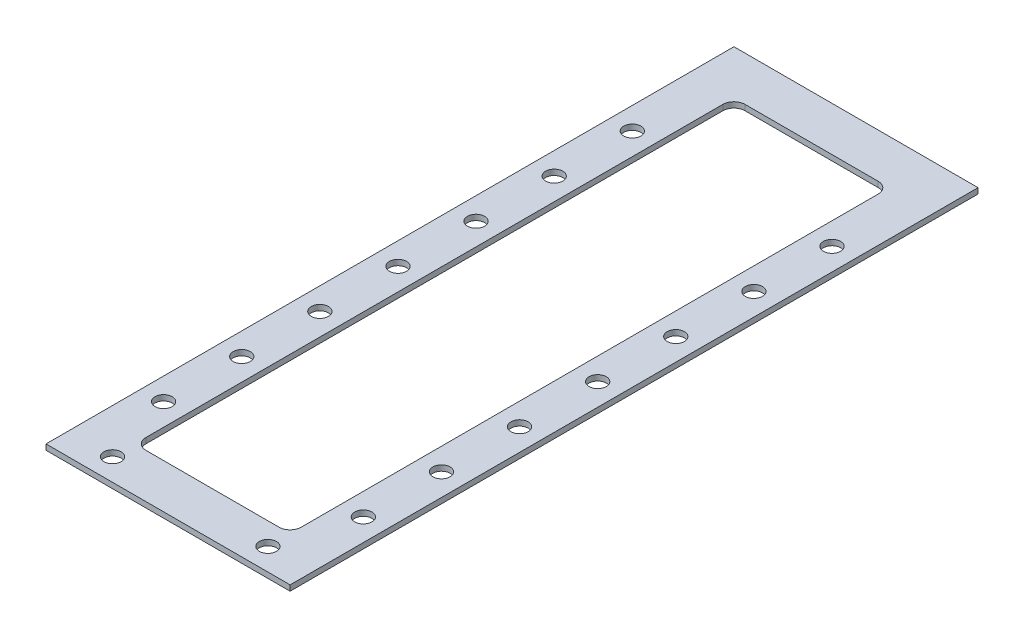
ISO-10303-21;
HEADER;
FILE_DESCRIPTION(('STEP AP214'),'2;1');
FILE_NAME('part.step','',(''),(''),'','','');
FILE_SCHEMA(('AUTOMOTIVE_DESIGN { 1 0 10303 214 1 1 1 1 }'));
ENDSEC;
DATA;
#1=APPLICATION_CONTEXT('core data for automotive mechanical design processes');
#2=APPLICATION_PROTOCOL_DEFINITION('international standard','automotive_design',2000,#1);
#3=PRODUCT_CONTEXT('',#1,'mechanical');
#4=PRODUCT('Part','Part','',(#3));
#5=PRODUCT_RELATED_PRODUCT_CATEGORY('part','',(#4));
#6=PRODUCT_DEFINITION_FORMATION('','',#4);
#7=PRODUCT_DEFINITION_CONTEXT('part definition',#1,'design');
#8=PRODUCT_DEFINITION('design','',#6,#7);
#9=PRODUCT_DEFINITION_SHAPE('','',#8);
#10=(LENGTH_UNIT() NAMED_UNIT(*) SI_UNIT(.MILLI.,.METRE.));
#11=(NAMED_UNIT(*) PLANE_ANGLE_UNIT() SI_UNIT($,.RADIAN.));
#12=(NAMED_UNIT(*) SI_UNIT($,.STERADIAN.) SOLID_ANGLE_UNIT());
#13=UNCERTAINTY_MEASURE_WITH_UNIT(LENGTH_MEASURE(1.E-05),#10,'distance_accuracy_value','');
#14=(GEOMETRIC_REPRESENTATION_CONTEXT(3) GLOBAL_UNCERTAINTY_ASSIGNED_CONTEXT((#13)) GLOBAL_UNIT_ASSIGNED_CONTEXT((#10,
#11,#12)) REPRESENTATION_CONTEXT('',''));
#15=CARTESIAN_POINT('',(0.,0.,0.));
#16=DIRECTION('',(0.,0.,1.));
#17=DIRECTION('',(1.,0.,0.));
#18=AXIS2_PLACEMENT_3D('',#15,#16,#17);
#19=CARTESIAN_POINT('',(0.0253999999999636,1.5875,-196.8246));
#20=DIRECTION('',(0.,-1.,0.));
#21=DIRECTION('',(0.,0.,-1.));
#22=AXIS2_PLACEMENT_3D('',#19,#20,#21);
#23=PLANE('',#22);
#24=CARTESIAN_POINT('',(57.15,1.5875,-6.35));
#25=DIRECTION('',(0.,-1.,0.));
#26=DIRECTION('',(0.,0.,-1.));
#27=AXIS2_PLACEMENT_3D('',#24,#25,#26);
#28=CIRCLE('',#27,2.45745);
#29=CARTESIAN_POINT('',(57.15,1.5875,-8.80745));
#30=VERTEX_POINT('',#29);
#31=EDGE_CURVE('E434',#30,#30,#28,.T.);
#32=ORIENTED_EDGE('',*,*,#31,.T.);
#33=EDGE_LOOP('',(#32));
#34=FACE_BOUND('',#33,.T.);
#35=CARTESIAN_POINT('',(12.7,1.5875,-6.35000000000001));
#36=DIRECTION('',(0.,-1.,0.));
#37=DIRECTION('',(0.,0.,-1.));
#38=AXIS2_PLACEMENT_3D('',#35,#36,#37);
#39=CIRCLE('',#38,2.45745);
#40=CARTESIAN_POINT('',(12.7,1.5875,-8.80745));
#41=VERTEX_POINT('',#40);
#42=EDGE_CURVE('E448',#41,#41,#39,.T.);
#43=ORIENTED_EDGE('',*,*,#42,.T.);
#44=EDGE_LOOP('',(#43));
#45=FACE_BOUND('',#44,.T.);
#46=CARTESIAN_POINT('',(63.5,1.5875,-27.305));
#47=DIRECTION('',(0.,-1.,0.));
#48=DIRECTION('',(0.,0.,-1.));
#49=AXIS2_PLACEMENT_3D('',#46,#47,#48);
#50=CIRCLE('',#49,2.45745);
#51=CARTESIAN_POINT('',(63.5,1.5875,-29.76245));
#52=VERTEX_POINT('',#51);
#53=EDGE_CURVE('E456',#52,#52,#50,.T.);
#54=ORIENTED_EDGE('',*,*,#53,.T.);
#55=EDGE_LOOP('',(#54));
#56=FACE_BOUND('',#55,.T.);
#57=CARTESIAN_POINT('',(6.34999999999999,1.5875,-27.305));
#58=DIRECTION('',(0.,-1.,0.));
#59=DIRECTION('',(0.,0.,-1.));
#60=AXIS2_PLACEMENT_3D('',#57,#58,#59);
#61=CIRCLE('',#60,2.45745);
#62=CARTESIAN_POINT('',(6.34999999999999,1.5875,-29.76245));
#63=VERTEX_POINT('',#62);
#64=EDGE_CURVE('E464',#63,#63,#61,.T.);
#65=ORIENTED_EDGE('',*,*,#64,.T.);
#66=EDGE_LOOP('',(#65));
#67=FACE_BOUND('',#66,.T.);
#68=CARTESIAN_POINT('',(63.5000000000004,1.5875,-139.065));
#69=DIRECTION('',(0.,-1.,0.));
#70=DIRECTION('',(0.,0.,-1.));
#71=AXIS2_PLACEMENT_3D('',#68,#69,#70);
#72=CIRCLE('',#71,2.45745);
#73=CARTESIAN_POINT('',(63.5000000000004,1.5875,-141.52245));
#74=VERTEX_POINT('',#73);
#75=EDGE_CURVE('E472',#74,#74,#72,.T.);
#76=ORIENTED_EDGE('',*,*,#75,.T.);
#77=EDGE_LOOP('',(#76));
#78=FACE_BOUND('',#77,.T.);
#79=CARTESIAN_POINT('',(63.5000000000003,1.5875,-116.713));
#80=DIRECTION('',(0.,-1.,0.));
#81=DIRECTION('',(0.,0.,-1.));
#82=AXIS2_PLACEMENT_3D('',#79,#80,#81);
#83=CIRCLE('',#82,2.45745);
#84=CARTESIAN_POINT('',(63.5000000000003,1.5875,-119.17045));
#85=VERTEX_POINT('',#84);
#86=EDGE_CURVE('E480',#85,#85,#83,.T.);
#87=ORIENTED_EDGE('',*,*,#86,.T.);
#88=EDGE_LOOP('',(#87));
#89=FACE_BOUND('',#88,.T.);
#90=CARTESIAN_POINT('',(63.5000000000002,1.5875,-94.361));
#91=DIRECTION('',(0.,-1.,0.));
#92=DIRECTION('',(0.,0.,-1.));
#93=AXIS2_PLACEMENT_3D('',#90,#91,#92);
#94=CIRCLE('',#93,2.45745);
#95=CARTESIAN_POINT('',(63.5000000000002,1.5875,-96.81845));
#96=VERTEX_POINT('',#95);
#97=EDGE_CURVE('E488',#96,#96,#94,.T.);
#98=ORIENTED_EDGE('',*,*,#97,.T.);
#99=EDGE_LOOP('',(#98));
#100=FACE_BOUND('',#99,.T.);
#101=CARTESIAN_POINT('',(63.5000000000002,1.5875,-72.009));
#102=DIRECTION('',(0.,-1.,0.));
#103=DIRECTION('',(0.,0.,-1.));
#104=AXIS2_PLACEMENT_3D('',#101,#102,#103);
#105=CIRCLE('',#104,2.45745);
#106=CARTESIAN_POINT('',(63.5000000000002,1.5875,-74.46645));
#107=VERTEX_POINT('',#106);
#108=EDGE_CURVE('E496',#107,#107,#105,.T.);
#109=ORIENTED_EDGE('',*,*,#108,.T.);
#110=EDGE_LOOP('',(#109));
#111=FACE_BOUND('',#110,.T.);
#112=CARTESIAN_POINT('',(6.35000000000007,1.5875,-49.657));
#113=DIRECTION('',(0.,-1.,0.));
#114=DIRECTION('',(0.,0.,-1.));
#115=AXIS2_PLACEMENT_3D('',#112,#113,#114);
#116=CIRCLE('',#115,2.45745);
#117=CARTESIAN_POINT('',(6.35000000000007,1.5875,-52.11445));
#118=VERTEX_POINT('',#117);
#119=EDGE_CURVE('E504',#118,#118,#116,.T.);
#120=ORIENTED_EDGE('',*,*,#119,.T.);
#121=EDGE_LOOP('',(#120));
#122=FACE_BOUND('',#121,.T.);
#123=CARTESIAN_POINT('',(6.35000000000015,1.5875,-72.009));
#124=DIRECTION('',(0.,-1.,0.));
#125=DIRECTION('',(0.,0.,-1.));
#126=AXIS2_PLACEMENT_3D('',#123,#124,#125);
#127=CIRCLE('',#126,2.45745);
#128=CARTESIAN_POINT('',(6.35000000000015,1.5875,-74.46645));
#129=VERTEX_POINT('',#128);
#130=EDGE_CURVE('E512',#129,#129,#127,.T.);
#131=ORIENTED_EDGE('',*,*,#130,.T.);
#132=EDGE_LOOP('',(#131));
#133=FACE_BOUND('',#132,.T.);
#134=CARTESIAN_POINT('',(6.35000000000022,1.5875,-94.361));
#135=DIRECTION('',(0.,-1.,0.));
#136=DIRECTION('',(0.,0.,-1.));
#137=AXIS2_PLACEMENT_3D('',#134,#135,#136);
#138=CIRCLE('',#137,2.45745);
#139=CARTESIAN_POINT('',(6.35000000000022,1.5875,-96.81845));
#140=VERTEX_POINT('',#139);
#141=EDGE_CURVE('E520',#140,#140,#138,.T.);
#142=ORIENTED_EDGE('',*,*,#141,.T.);
#143=EDGE_LOOP('',(#142));
#144=FACE_BOUND('',#143,.T.);
#145=CARTESIAN_POINT('',(6.3500000000003,1.5875,-116.713));
#146=DIRECTION('',(0.,-1.,0.));
#147=DIRECTION('',(0.,0.,-1.));
#148=AXIS2_PLACEMENT_3D('',#145,#146,#147);
#149=CIRCLE('',#148,2.45745);
#150=CARTESIAN_POINT('',(6.3500000000003,1.5875,-119.17045));
#151=VERTEX_POINT('',#150);
#152=EDGE_CURVE('E528',#151,#151,#149,.T.);
#153=ORIENTED_EDGE('',*,*,#152,.T.);
#154=EDGE_LOOP('',(#153));
#155=FACE_BOUND('',#154,.T.);
#156=CARTESIAN_POINT('',(6.35000000000038,1.5875,-139.065));
#157=DIRECTION('',(0.,-1.,0.));
#158=DIRECTION('',(0.,0.,-1.));
#159=AXIS2_PLACEMENT_3D('',#156,#157,#158);
#160=CIRCLE('',#159,2.45745);
#161=CARTESIAN_POINT('',(6.35000000000038,1.5875,-141.52245));
#162=VERTEX_POINT('',#161);
#163=EDGE_CURVE('E536',#162,#162,#160,.T.);
#164=ORIENTED_EDGE('',*,*,#163,.T.);
#165=EDGE_LOOP('',(#164));
#166=FACE_BOUND('',#165,.T.);
#167=CARTESIAN_POINT('',(63.5000000000001,1.5875,-49.657));
#168=DIRECTION('',(0.,-1.,0.));
#169=DIRECTION('',(0.,0.,-1.));
#170=AXIS2_PLACEMENT_3D('',#167,#168,#169);
#171=CIRCLE('',#170,2.45745);
#172=CARTESIAN_POINT('',(63.5000000000001,1.5875,-52.11445));
#173=VERTEX_POINT('',#172);
#174=EDGE_CURVE('E544',#173,#173,#171,.T.);
#175=ORIENTED_EDGE('',*,*,#174,.T.);
#176=EDGE_LOOP('',(#175));
#177=FACE_BOUND('',#176,.T.);
#178=CARTESIAN_POINT('',(63.5000000000005,1.5875,-161.417));
#179=DIRECTION('',(0.,-1.,0.));
#180=DIRECTION('',(0.,0.,-1.));
#181=AXIS2_PLACEMENT_3D('',#178,#179,#180);
#182=CIRCLE('',#181,2.45745);
#183=CARTESIAN_POINT('',(63.5000000000005,1.5875,-163.87445));
#184=VERTEX_POINT('',#183);
#185=EDGE_CURVE('E552',#184,#184,#182,.T.);
#186=ORIENTED_EDGE('',*,*,#185,.T.);
#187=EDGE_LOOP('',(#186));
#188=FACE_BOUND('',#187,.T.);
#189=CARTESIAN_POINT('',(6.35000000000045,1.5875,-161.417));
#190=DIRECTION('',(0.,-1.,0.));
#191=DIRECTION('',(0.,0.,-1.));
#192=AXIS2_PLACEMENT_3D('',#189,#190,#191);
#193=CIRCLE('',#192,2.45745);
#194=CARTESIAN_POINT('',(6.35000000000045,1.5875,-163.87445));
#195=VERTEX_POINT('',#194);
#196=EDGE_CURVE('E193',#195,#195,#193,.T.);
#197=ORIENTED_EDGE('',*,*,#196,.T.);
#198=EDGE_LOOP('',(#197));
#199=FACE_BOUND('',#198,.T.);
#200=DIRECTION('',(0.,0.,1.));
#201=VECTOR('',#200,1.);
#202=CARTESIAN_POINT('',(0.,1.5875,0.));
#203=LINE('',#202,#201);
#204=CARTESIAN_POINT('',(0.,1.5875,-196.8246));
#205=VERTEX_POINT('',#204);
#206=CARTESIAN_POINT('',(0.,1.5875,0.));
#207=VERTEX_POINT('',#206);
#208=EDGE_CURVE('E237',#205,#207,#203,.T.);
#209=ORIENTED_EDGE('',*,*,#208,.T.);
#210=DIRECTION('',(1.,0.,0.));
#211=VECTOR('',#210,1.);
#212=CARTESIAN_POINT('',(0.,1.5875,0.));
#213=LINE('',#212,#211);
#214=CARTESIAN_POINT('',(69.85,1.5875,0.));
#215=VERTEX_POINT('',#214);
#216=EDGE_CURVE('E241',#207,#215,#213,.T.);
#217=ORIENTED_EDGE('',*,*,#216,.T.);
#218=DIRECTION('',(0.,0.,-1.));
#219=VECTOR('',#218,1.);
#220=CARTESIAN_POINT('',(69.85,1.5875,0.));
#221=LINE('',#220,#219);
#222=CARTESIAN_POINT('',(69.85,1.5875,-196.8246));
#223=VERTEX_POINT('',#222);
#224=EDGE_CURVE('E245',#215,#223,#221,.T.);
#225=ORIENTED_EDGE('',*,*,#224,.T.);
#226=CARTESIAN_POINT('',(69.8246,1.5875,-196.8246));
#227=DIRECTION('',(0.,1.,0.));
#228=DIRECTION('',(0.,0.,1.));
#229=AXIS2_PLACEMENT_3D('',#226,#227,#228);
#230=CIRCLE('',#229,0.0254000000000087);
#231=CARTESIAN_POINT('',(69.8246,1.5875,-196.85));
#232=VERTEX_POINT('',#231);
#233=EDGE_CURVE('E248',#223,#232,#230,.T.);
#234=ORIENTED_EDGE('',*,*,#233,.T.);
#235=DIRECTION('',(-1.,0.,0.));
#236=VECTOR('',#235,1.);
#237=CARTESIAN_POINT('',(0.0253999999999636,1.5875,-196.85));
#238=LINE('',#237,#236);
#239=CARTESIAN_POINT('',(0.0253999999999636,1.5875,-196.85));
#240=VERTEX_POINT('',#239);
#241=EDGE_CURVE('E251',#232,#240,#238,.T.);
#242=ORIENTED_EDGE('',*,*,#241,.T.);
#243=CARTESIAN_POINT('',(0.0253999999999636,1.5875,-196.8246));
#244=DIRECTION('',(0.,1.,0.));
#245=DIRECTION('',(0.,0.,-1.));
#246=AXIS2_PLACEMENT_3D('',#243,#244,#245);
#247=CIRCLE('',#246,0.0254000000000044);
#248=EDGE_CURVE('E254',#240,#205,#247,.T.);
#249=ORIENTED_EDGE('',*,*,#248,.T.);
#250=EDGE_LOOP('',(#209,#217,#225,#234,#242,#249));
#251=FACE_BOUND('',#250,.T.);
#252=CARTESIAN_POINT('',(15.875,1.5875,-15.875));
#253=DIRECTION('',(0.,1.,0.));
#254=DIRECTION('',(0.,0.,1.));
#255=AXIS2_PLACEMENT_3D('',#252,#253,#254);
#256=CIRCLE('',#255,3.175);
#257=CARTESIAN_POINT('',(12.7,1.5875,-15.875));
#258=VERTEX_POINT('',#257);
#259=CARTESIAN_POINT('',(15.875,1.5875,-12.7));
#260=VERTEX_POINT('',#259);
#261=EDGE_CURVE('E145',#258,#260,#256,.T.);
#262=ORIENTED_EDGE('',*,*,#261,.F.);
#263=DIRECTION('',(0.,0.,1.));
#264=VECTOR('',#263,1.);
#265=CARTESIAN_POINT('',(12.7,1.5875,-15.875));
#266=LINE('',#265,#264);
#267=CARTESIAN_POINT('',(12.7,1.5875,-180.975));
#268=VERTEX_POINT('',#267);
#269=EDGE_CURVE('E188',#268,#258,#266,.T.);
#270=ORIENTED_EDGE('',*,*,#269,.F.);
#271=CARTESIAN_POINT('',(15.875,1.5875,-180.975));
#272=DIRECTION('',(0.,1.,0.));
#273=DIRECTION('',(0.,0.,-1.));
#274=AXIS2_PLACEMENT_3D('',#271,#272,#273);
#275=CIRCLE('',#274,3.17500000000001);
#276=CARTESIAN_POINT('',(15.875,1.5875,-184.15));
#277=VERTEX_POINT('',#276);
#278=EDGE_CURVE('E185',#277,#268,#275,.T.);
#279=ORIENTED_EDGE('',*,*,#278,.F.);
#280=DIRECTION('',(-1.,0.,0.));
#281=VECTOR('',#280,1.);
#282=CARTESIAN_POINT('',(15.875,1.5875,-184.15));
#283=LINE('',#282,#281);
#284=CARTESIAN_POINT('',(53.975,1.5875,-184.15));
#285=VERTEX_POINT('',#284);
#286=EDGE_CURVE('E182',#285,#277,#283,.T.);
#287=ORIENTED_EDGE('',*,*,#286,.F.);
#288=CARTESIAN_POINT('',(53.975,1.5875,-180.975));
#289=DIRECTION('',(0.,1.,0.));
#290=DIRECTION('',(0.,0.,-1.));
#291=AXIS2_PLACEMENT_3D('',#288,#289,#290);
#292=CIRCLE('',#291,3.17500000000001);
#293=CARTESIAN_POINT('',(57.15,1.5875,-180.975));
#294=VERTEX_POINT('',#293);
#295=EDGE_CURVE('E179',#294,#285,#292,.T.);
#296=ORIENTED_EDGE('',*,*,#295,.F.);
#297=DIRECTION('',(0.,0.,-1.));
#298=VECTOR('',#297,1.);
#299=CARTESIAN_POINT('',(57.15,1.5875,-15.875));
#300=LINE('',#299,#298);
#301=CARTESIAN_POINT('',(57.15,1.5875,-15.875));
#302=VERTEX_POINT('',#301);
#303=EDGE_CURVE('E173',#302,#294,#300,.T.);
#304=ORIENTED_EDGE('',*,*,#303,.F.);
#305=CARTESIAN_POINT('',(53.975,1.5875,-15.875));
#306=DIRECTION('',(0.,1.,0.));
#307=DIRECTION('',(0.,0.,-1.));
#308=AXIS2_PLACEMENT_3D('',#305,#306,#307);
#309=CIRCLE('',#308,3.175);
#310=CARTESIAN_POINT('',(53.975,1.5875,-12.7));
#311=VERTEX_POINT('',#310);
#312=EDGE_CURVE('E168',#311,#302,#309,.T.);
#313=ORIENTED_EDGE('',*,*,#312,.F.);
#314=DIRECTION('',(1.,0.,0.));
#315=VECTOR('',#314,1.);
#316=CARTESIAN_POINT('',(15.875,1.5875,-12.7));
#317=LINE('',#316,#315);
#318=EDGE_CURVE('E154',#260,#311,#317,.T.);
#319=ORIENTED_EDGE('',*,*,#318,.F.);
#320=EDGE_LOOP('',(#262,#270,#279,#287,#296,#304,#313,#319));
#321=FACE_BOUND('',#320,.T.);
#322=ADVANCED_FACE('F43',(#34,#45,#56,#67,#78,#89,#100,#111,#122,#133,#144,#155,#166,#177,#188,
#199,#251,#321),#23,.F.);
#323=CARTESIAN_POINT('',(0.0253999999999636,0.,-196.8246));
#324=DIRECTION('',(0.,-1.,0.));
#325=DIRECTION('',(0.,0.,-1.));
#326=AXIS2_PLACEMENT_3D('',#323,#324,#325);
#327=PLANE('',#326);
#328=CARTESIAN_POINT('',(57.15,0.,-6.35));
#329=DIRECTION('',(0.,-1.,0.));
#330=DIRECTION('',(0.,0.,-1.));
#331=AXIS2_PLACEMENT_3D('',#328,#329,#330);
#332=CIRCLE('',#331,2.45744999999999);
#333=CARTESIAN_POINT('',(57.15,0.,-8.80744999999999));
#334=VERTEX_POINT('',#333);
#335=EDGE_CURVE('E437',#334,#334,#332,.T.);
#336=ORIENTED_EDGE('',*,*,#335,.F.);
#337=EDGE_LOOP('',(#336));
#338=FACE_BOUND('',#337,.T.);
#339=CARTESIAN_POINT('',(12.7,0.,-6.35000000000001));
#340=DIRECTION('',(0.,-1.,0.));
#341=DIRECTION('',(0.,0.,-1.));
#342=AXIS2_PLACEMENT_3D('',#339,#340,#341);
#343=CIRCLE('',#342,2.45744999999999);
#344=CARTESIAN_POINT('',(12.7,0.,-8.80744999999999));
#345=VERTEX_POINT('',#344);
#346=EDGE_CURVE('E442',#345,#345,#343,.T.);
#347=ORIENTED_EDGE('',*,*,#346,.F.);
#348=EDGE_LOOP('',(#347));
#349=FACE_BOUND('',#348,.T.);
#350=CARTESIAN_POINT('',(63.5,0.,-27.305));
#351=DIRECTION('',(0.,-1.,0.));
#352=DIRECTION('',(0.,0.,-1.));
#353=AXIS2_PLACEMENT_3D('',#350,#351,#352);
#354=CIRCLE('',#353,2.45744999999999);
#355=CARTESIAN_POINT('',(63.5,0.,-29.76245));
#356=VERTEX_POINT('',#355);
#357=EDGE_CURVE('E452',#356,#356,#354,.T.);
#358=ORIENTED_EDGE('',*,*,#357,.F.);
#359=EDGE_LOOP('',(#358));
#360=FACE_BOUND('',#359,.T.);
#361=CARTESIAN_POINT('',(6.34999999999999,0.,-27.305));
#362=DIRECTION('',(0.,-1.,0.));
#363=DIRECTION('',(0.,0.,-1.));
#364=AXIS2_PLACEMENT_3D('',#361,#362,#363);
#365=CIRCLE('',#364,2.45744999999999);
#366=CARTESIAN_POINT('',(6.34999999999999,0.,-29.76245));
#367=VERTEX_POINT('',#366);
#368=EDGE_CURVE('E460',#367,#367,#365,.T.);
#369=ORIENTED_EDGE('',*,*,#368,.F.);
#370=EDGE_LOOP('',(#369));
#371=FACE_BOUND('',#370,.T.);
#372=CARTESIAN_POINT('',(63.5000000000004,0.,-139.065));
#373=DIRECTION('',(0.,-1.,0.));
#374=DIRECTION('',(0.,0.,-1.));
#375=AXIS2_PLACEMENT_3D('',#372,#373,#374);
#376=CIRCLE('',#375,2.45744999999999);
#377=CARTESIAN_POINT('',(63.5000000000004,0.,-141.52245));
#378=VERTEX_POINT('',#377);
#379=EDGE_CURVE('E468',#378,#378,#376,.T.);
#380=ORIENTED_EDGE('',*,*,#379,.F.);
#381=EDGE_LOOP('',(#380));
#382=FACE_BOUND('',#381,.T.);
#383=CARTESIAN_POINT('',(63.5000000000003,0.,-116.713));
#384=DIRECTION('',(0.,-1.,0.));
#385=DIRECTION('',(0.,0.,-1.));
#386=AXIS2_PLACEMENT_3D('',#383,#384,#385);
#387=CIRCLE('',#386,2.45744999999999);
#388=CARTESIAN_POINT('',(63.5000000000003,0.,-119.17045));
#389=VERTEX_POINT('',#388);
#390=EDGE_CURVE('E476',#389,#389,#387,.T.);
#391=ORIENTED_EDGE('',*,*,#390,.F.);
#392=EDGE_LOOP('',(#391));
#393=FACE_BOUND('',#392,.T.);
#394=CARTESIAN_POINT('',(63.5000000000002,0.,-94.361));
#395=DIRECTION('',(0.,-1.,0.));
#396=DIRECTION('',(0.,0.,-1.));
#397=AXIS2_PLACEMENT_3D('',#394,#395,#396);
#398=CIRCLE('',#397,2.45744999999999);
#399=CARTESIAN_POINT('',(63.5000000000002,0.,-96.81845));
#400=VERTEX_POINT('',#399);
#401=EDGE_CURVE('E484',#400,#400,#398,.T.);
#402=ORIENTED_EDGE('',*,*,#401,.F.);
#403=EDGE_LOOP('',(#402));
#404=FACE_BOUND('',#403,.T.);
#405=CARTESIAN_POINT('',(63.5000000000002,0.,-72.009));
#406=DIRECTION('',(0.,-1.,0.));
#407=DIRECTION('',(0.,0.,-1.));
#408=AXIS2_PLACEMENT_3D('',#405,#406,#407);
#409=CIRCLE('',#408,2.45744999999999);
#410=CARTESIAN_POINT('',(63.5000000000002,0.,-74.46645));
#411=VERTEX_POINT('',#410);
#412=EDGE_CURVE('E492',#411,#411,#409,.T.);
#413=ORIENTED_EDGE('',*,*,#412,.F.);
#414=EDGE_LOOP('',(#413));
#415=FACE_BOUND('',#414,.T.);
#416=CARTESIAN_POINT('',(6.35000000000007,0.,-49.657));
#417=DIRECTION('',(0.,-1.,0.));
#418=DIRECTION('',(0.,0.,-1.));
#419=AXIS2_PLACEMENT_3D('',#416,#417,#418);
#420=CIRCLE('',#419,2.45744999999999);
#421=CARTESIAN_POINT('',(6.35000000000007,0.,-52.11445));
#422=VERTEX_POINT('',#421);
#423=EDGE_CURVE('E500',#422,#422,#420,.T.);
#424=ORIENTED_EDGE('',*,*,#423,.F.);
#425=EDGE_LOOP('',(#424));
#426=FACE_BOUND('',#425,.T.);
#427=CARTESIAN_POINT('',(6.35000000000015,0.,-72.009));
#428=DIRECTION('',(0.,-1.,0.));
#429=DIRECTION('',(0.,0.,-1.));
#430=AXIS2_PLACEMENT_3D('',#427,#428,#429);
#431=CIRCLE('',#430,2.45744999999999);
#432=CARTESIAN_POINT('',(6.35000000000015,0.,-74.46645));
#433=VERTEX_POINT('',#432);
#434=EDGE_CURVE('E508',#433,#433,#431,.T.);
#435=ORIENTED_EDGE('',*,*,#434,.F.);
#436=EDGE_LOOP('',(#435));
#437=FACE_BOUND('',#436,.T.);
#438=CARTESIAN_POINT('',(6.35000000000022,0.,-94.361));
#439=DIRECTION('',(0.,-1.,0.));
#440=DIRECTION('',(0.,0.,-1.));
#441=AXIS2_PLACEMENT_3D('',#438,#439,#440);
#442=CIRCLE('',#441,2.45744999999999);
#443=CARTESIAN_POINT('',(6.35000000000022,0.,-96.81845));
#444=VERTEX_POINT('',#443);
#445=EDGE_CURVE('E516',#444,#444,#442,.T.);
#446=ORIENTED_EDGE('',*,*,#445,.F.);
#447=EDGE_LOOP('',(#446));
#448=FACE_BOUND('',#447,.T.);
#449=CARTESIAN_POINT('',(6.3500000000003,0.,-116.713));
#450=DIRECTION('',(0.,-1.,0.));
#451=DIRECTION('',(0.,0.,-1.));
#452=AXIS2_PLACEMENT_3D('',#449,#450,#451);
#453=CIRCLE('',#452,2.45744999999999);
#454=CARTESIAN_POINT('',(6.3500000000003,0.,-119.17045));
#455=VERTEX_POINT('',#454);
#456=EDGE_CURVE('E524',#455,#455,#453,.T.);
#457=ORIENTED_EDGE('',*,*,#456,.F.);
#458=EDGE_LOOP('',(#457));
#459=FACE_BOUND('',#458,.T.);
#460=CARTESIAN_POINT('',(6.35000000000038,0.,-139.065));
#461=DIRECTION('',(0.,-1.,0.));
#462=DIRECTION('',(0.,0.,-1.));
#463=AXIS2_PLACEMENT_3D('',#460,#461,#462);
#464=CIRCLE('',#463,2.45744999999999);
#465=CARTESIAN_POINT('',(6.35000000000038,0.,-141.52245));
#466=VERTEX_POINT('',#465);
#467=EDGE_CURVE('E532',#466,#466,#464,.T.);
#468=ORIENTED_EDGE('',*,*,#467,.F.);
#469=EDGE_LOOP('',(#468));
#470=FACE_BOUND('',#469,.T.);
#471=CARTESIAN_POINT('',(63.5000000000001,0.,-49.657));
#472=DIRECTION('',(0.,-1.,0.));
#473=DIRECTION('',(0.,0.,-1.));
#474=AXIS2_PLACEMENT_3D('',#471,#472,#473);
#475=CIRCLE('',#474,2.45744999999999);
#476=CARTESIAN_POINT('',(63.5000000000001,0.,-52.11445));
#477=VERTEX_POINT('',#476);
#478=EDGE_CURVE('E540',#477,#477,#475,.T.);
#479=ORIENTED_EDGE('',*,*,#478,.F.);
#480=EDGE_LOOP('',(#479));
#481=FACE_BOUND('',#480,.T.);
#482=CARTESIAN_POINT('',(63.5000000000005,0.,-161.417));
#483=DIRECTION('',(0.,-1.,0.));
#484=DIRECTION('',(0.,0.,-1.));
#485=AXIS2_PLACEMENT_3D('',#482,#483,#484);
#486=CIRCLE('',#485,2.45744999999999);
#487=CARTESIAN_POINT('',(63.5000000000005,0.,-163.87445));
#488=VERTEX_POINT('',#487);
#489=EDGE_CURVE('E548',#488,#488,#486,.T.);
#490=ORIENTED_EDGE('',*,*,#489,.F.);
#491=EDGE_LOOP('',(#490));
#492=FACE_BOUND('',#491,.T.);
#493=CARTESIAN_POINT('',(6.35000000000045,0.,-161.417));
#494=DIRECTION('',(0.,-1.,0.));
#495=DIRECTION('',(0.,0.,-1.));
#496=AXIS2_PLACEMENT_3D('',#493,#494,#495);
#497=CIRCLE('',#496,2.45744999999999);
#498=CARTESIAN_POINT('',(6.35000000000045,0.,-163.87445));
#499=VERTEX_POINT('',#498);
#500=EDGE_CURVE('E556',#499,#499,#497,.T.);
#501=ORIENTED_EDGE('',*,*,#500,.F.);
#502=EDGE_LOOP('',(#501));
#503=FACE_BOUND('',#502,.T.);
#504=DIRECTION('',(0.,0.,1.));
#505=VECTOR('',#504,1.);
#506=CARTESIAN_POINT('',(0.,0.,0.));
#507=LINE('',#506,#505);
#508=CARTESIAN_POINT('',(0.,0.,-196.8246));
#509=VERTEX_POINT('',#508);
#510=CARTESIAN_POINT('',(0.,0.,0.));
#511=VERTEX_POINT('',#510);
#512=EDGE_CURVE('E163',#509,#511,#507,.T.);
#513=ORIENTED_EDGE('',*,*,#512,.F.);
#514=CARTESIAN_POINT('',(0.0253999999999636,0.,-196.8246));
#515=DIRECTION('',(0.,1.,0.));
#516=DIRECTION('',(0.,0.,-1.));
#517=AXIS2_PLACEMENT_3D('',#514,#515,#516);
#518=CIRCLE('',#517,0.0254000000000044);
#519=CARTESIAN_POINT('',(0.0253999999999636,0.,-196.85));
#520=VERTEX_POINT('',#519);
#521=EDGE_CURVE('E242',#520,#509,#518,.T.);
#522=ORIENTED_EDGE('',*,*,#521,.F.);
#523=DIRECTION('',(-1.,0.,0.));
#524=VECTOR('',#523,1.);
#525=CARTESIAN_POINT('',(0.0253999999999636,0.,-196.85));
#526=LINE('',#525,#524);
#527=CARTESIAN_POINT('',(69.8246,0.,-196.85));
#528=VERTEX_POINT('',#527);
#529=EDGE_CURVE('E270',#528,#520,#526,.T.);
#530=ORIENTED_EDGE('',*,*,#529,.F.);
#531=CARTESIAN_POINT('',(69.8246,0.,-196.8246));
#532=DIRECTION('',(0.,1.,0.));
#533=DIRECTION('',(0.,0.,1.));
#534=AXIS2_PLACEMENT_3D('',#531,#532,#533);
#535=CIRCLE('',#534,0.0254000000000087);
#536=CARTESIAN_POINT('',(69.85,0.,-196.8246));
#537=VERTEX_POINT('',#536);
#538=EDGE_CURVE('E267',#537,#528,#535,.T.);
#539=ORIENTED_EDGE('',*,*,#538,.F.);
#540=DIRECTION('',(0.,0.,-1.));
#541=VECTOR('',#540,1.);
#542=CARTESIAN_POINT('',(69.85,0.,0.));
#543=LINE('',#542,#541);
#544=CARTESIAN_POINT('',(69.85,0.,0.));
#545=VERTEX_POINT('',#544);
#546=EDGE_CURVE('E264',#545,#537,#543,.T.);
#547=ORIENTED_EDGE('',*,*,#546,.F.);
#548=DIRECTION('',(1.,0.,0.));
#549=VECTOR('',#548,1.);
#550=CARTESIAN_POINT('',(0.,0.,0.));
#551=LINE('',#550,#549);
#552=EDGE_CURVE('E261',#511,#545,#551,.T.);
#553=ORIENTED_EDGE('',*,*,#552,.F.);
#554=EDGE_LOOP('',(#513,#522,#530,#539,#547,#553));
#555=FACE_BOUND('',#554,.T.);
#556=DIRECTION('',(0.,0.,1.));
#557=VECTOR('',#556,1.);
#558=CARTESIAN_POINT('',(12.7,0.,-15.875));
#559=LINE('',#558,#557);
#560=CARTESIAN_POINT('',(12.7,0.,-180.975));
#561=VERTEX_POINT('',#560);
#562=CARTESIAN_POINT('',(12.7,0.,-15.875));
#563=VERTEX_POINT('',#562);
#564=EDGE_CURVE('E155',#561,#563,#559,.T.);
#565=ORIENTED_EDGE('',*,*,#564,.T.);
#566=CARTESIAN_POINT('',(15.875,0.,-15.875));
#567=DIRECTION('',(0.,1.,0.));
#568=DIRECTION('',(0.,0.,1.));
#569=AXIS2_PLACEMENT_3D('',#566,#567,#568);
#570=CIRCLE('',#569,3.175);
#571=CARTESIAN_POINT('',(15.875,0.,-12.7));
#572=VERTEX_POINT('',#571);
#573=EDGE_CURVE('E67',#563,#572,#570,.T.);
#574=ORIENTED_EDGE('',*,*,#573,.T.);
#575=DIRECTION('',(1.,0.,0.));
#576=VECTOR('',#575,1.);
#577=CARTESIAN_POINT('',(15.875,0.,-12.7));
#578=LINE('',#577,#576);
#579=CARTESIAN_POINT('',(53.975,0.,-12.7));
#580=VERTEX_POINT('',#579);
#581=EDGE_CURVE('E161',#572,#580,#578,.T.);
#582=ORIENTED_EDGE('',*,*,#581,.T.);
#583=CARTESIAN_POINT('',(53.975,0.,-15.875));
#584=DIRECTION('',(0.,1.,0.));
#585=DIRECTION('',(0.,0.,-1.));
#586=AXIS2_PLACEMENT_3D('',#583,#584,#585);
#587=CIRCLE('',#586,3.175);
#588=CARTESIAN_POINT('',(57.15,0.,-15.875));
#589=VERTEX_POINT('',#588);
#590=EDGE_CURVE('E196',#580,#589,#587,.T.);
#591=ORIENTED_EDGE('',*,*,#590,.T.);
#592=DIRECTION('',(0.,0.,-1.));
#593=VECTOR('',#592,1.);
#594=CARTESIAN_POINT('',(57.15,0.,-15.875));
#595=LINE('',#594,#593);
#596=CARTESIAN_POINT('',(57.15,0.,-180.975));
#597=VERTEX_POINT('',#596);
#598=EDGE_CURVE('E200',#589,#597,#595,.T.);
#599=ORIENTED_EDGE('',*,*,#598,.T.);
#600=CARTESIAN_POINT('',(53.975,0.,-180.975));
#601=DIRECTION('',(0.,1.,0.));
#602=DIRECTION('',(0.,0.,-1.));
#603=AXIS2_PLACEMENT_3D('',#600,#601,#602);
#604=CIRCLE('',#603,3.17500000000001);
#605=CARTESIAN_POINT('',(53.975,0.,-184.15));
#606=VERTEX_POINT('',#605);
#607=EDGE_CURVE('E204',#597,#606,#604,.T.);
#608=ORIENTED_EDGE('',*,*,#607,.T.);
#609=DIRECTION('',(-1.,0.,0.));
#610=VECTOR('',#609,1.);
#611=CARTESIAN_POINT('',(15.875,0.,-184.15));
#612=LINE('',#611,#610);
#613=CARTESIAN_POINT('',(15.875,0.,-184.15));
#614=VERTEX_POINT('',#613);
#615=EDGE_CURVE('E208',#606,#614,#612,.T.);
#616=ORIENTED_EDGE('',*,*,#615,.T.);
#617=CARTESIAN_POINT('',(15.875,0.,-180.975));
#618=DIRECTION('',(0.,1.,0.));
#619=DIRECTION('',(0.,0.,-1.));
#620=AXIS2_PLACEMENT_3D('',#617,#618,#619);
#621=CIRCLE('',#620,3.17500000000001);
#622=EDGE_CURVE('E212',#614,#561,#621,.T.);
#623=ORIENTED_EDGE('',*,*,#622,.T.);
#624=EDGE_LOOP('',(#565,#574,#582,#591,#599,#608,#616,#623));
#625=FACE_BOUND('',#624,.T.);
#626=ADVANCED_FACE('F302',(#338,#349,#360,#371,#382,#393,#404,#415,#426,#437,#448,#459,#470,
#481,#492,#503,#555,#625),#327,.T.);
#627=CARTESIAN_POINT('',(0.,1.5875,0.));
#628=DIRECTION('',(1.,0.,0.));
#629=DIRECTION('',(0.,0.,-1.));
#630=AXIS2_PLACEMENT_3D('',#627,#628,#629);
#631=PLANE('',#630);
#632=ORIENTED_EDGE('',*,*,#512,.T.);
#633=DIRECTION('',(0.,-1.,0.));
#634=VECTOR('',#633,1.);
#635=CARTESIAN_POINT('',(0.,1.5875,0.));
#636=LINE('',#635,#634);
#637=EDGE_CURVE('E11',#207,#511,#636,.T.);
#638=ORIENTED_EDGE('',*,*,#637,.F.);
#639=ORIENTED_EDGE('',*,*,#208,.F.);
#640=DIRECTION('',(0.,-1.,0.));
#641=VECTOR('',#640,1.);
#642=CARTESIAN_POINT('',(0.,1.5875,-196.8246));
#643=LINE('',#642,#641);
#644=EDGE_CURVE('E257',#205,#509,#643,.T.);
#645=ORIENTED_EDGE('',*,*,#644,.T.);
#646=EDGE_LOOP('',(#632,#638,#639,#645));
#647=FACE_BOUND('',#646,.T.);
#648=ADVANCED_FACE('F45',(#647),#631,.F.);
#649=CARTESIAN_POINT('',(0.,1.5875,0.));
#650=DIRECTION('',(0.,0.,-1.));
#651=DIRECTION('',(-1.,0.,0.));
#652=AXIS2_PLACEMENT_3D('',#649,#650,#651);
#653=PLANE('',#652);
#654=ORIENTED_EDGE('',*,*,#552,.T.);
#655=DIRECTION('',(0.,-1.,0.));
#656=VECTOR('',#655,1.);
#657=CARTESIAN_POINT('',(69.85,1.5875,0.));
#658=LINE('',#657,#656);
#659=EDGE_CURVE('E52',#215,#545,#658,.T.);
#660=ORIENTED_EDGE('',*,*,#659,.F.);
#661=ORIENTED_EDGE('',*,*,#216,.F.);
#662=ORIENTED_EDGE('',*,*,#637,.T.);
#663=EDGE_LOOP('',(#654,#660,#661,#662));
#664=FACE_BOUND('',#663,.T.);
#665=ADVANCED_FACE('F319',(#664),#653,.F.);
#666=CARTESIAN_POINT('',(69.85,1.5875,0.));
#667=DIRECTION('',(-1.,0.,0.));
#668=DIRECTION('',(0.,0.,1.));
#669=AXIS2_PLACEMENT_3D('',#666,#667,#668);
#670=PLANE('',#669);
#671=ORIENTED_EDGE('',*,*,#546,.T.);
#672=DIRECTION('',(0.,-1.,0.));
#673=VECTOR('',#672,1.);
#674=CARTESIAN_POINT('',(69.85,1.5875,-196.8246));
#675=LINE('',#674,#673);
#676=EDGE_CURVE('E286',#223,#537,#675,.T.);
#677=ORIENTED_EDGE('',*,*,#676,.F.);
#678=ORIENTED_EDGE('',*,*,#224,.F.);
#679=ORIENTED_EDGE('',*,*,#659,.T.);
#680=EDGE_LOOP('',(#671,#677,#678,#679));
#681=FACE_BOUND('',#680,.T.);
#682=ADVANCED_FACE('F296',(#681),#670,.F.);
#683=CARTESIAN_POINT('',(69.8246,1.5875,-196.8246));
#684=DIRECTION('',(0.,-1.,0.));
#685=DIRECTION('',(0.,0.,-1.));
#686=AXIS2_PLACEMENT_3D('',#683,#684,#685);
#687=CYLINDRICAL_SURFACE('',#686,0.0254000000000087);
#688=ORIENTED_EDGE('',*,*,#538,.T.);
#689=DIRECTION('',(0.,-1.,0.));
#690=VECTOR('',#689,1.);
#691=CARTESIAN_POINT('',(69.8246,1.5875,-196.85));
#692=LINE('',#691,#690);
#693=EDGE_CURVE('E282',#232,#528,#692,.T.);
#694=ORIENTED_EDGE('',*,*,#693,.F.);
#695=ORIENTED_EDGE('',*,*,#233,.F.);
#696=ORIENTED_EDGE('',*,*,#676,.T.);
#697=EDGE_LOOP('',(#688,#694,#695,#696));
#698=FACE_BOUND('',#697,.T.);
#699=ADVANCED_FACE('F308',(#698),#687,.T.);
#700=CARTESIAN_POINT('',(0.0253999999999636,1.5875,-196.85));
#701=DIRECTION('',(0.,0.,1.));
#702=DIRECTION('',(1.,0.,0.));
#703=AXIS2_PLACEMENT_3D('',#700,#701,#702);
#704=PLANE('',#703);
#705=ORIENTED_EDGE('',*,*,#529,.T.);
#706=DIRECTION('',(0.,-1.,0.));
#707=VECTOR('',#706,1.);
#708=CARTESIAN_POINT('',(0.0253999999999636,1.5875,-196.85));
#709=LINE('',#708,#707);
#710=EDGE_CURVE('E278',#240,#520,#709,.T.);
#711=ORIENTED_EDGE('',*,*,#710,.F.);
#712=ORIENTED_EDGE('',*,*,#241,.F.);
#713=ORIENTED_EDGE('',*,*,#693,.T.);
#714=EDGE_LOOP('',(#705,#711,#712,#713));
#715=FACE_BOUND('',#714,.T.);
#716=ADVANCED_FACE('F312',(#715),#704,.F.);
#717=CARTESIAN_POINT('',(0.0253999999999636,1.5875,-196.8246));
#718=DIRECTION('',(0.,-1.,0.));
#719=DIRECTION('',(0.,0.,-1.));
#720=AXIS2_PLACEMENT_3D('',#717,#718,#719);
#721=CYLINDRICAL_SURFACE('',#720,0.0254000000000044);
#722=ORIENTED_EDGE('',*,*,#521,.T.);
#723=ORIENTED_EDGE('',*,*,#644,.F.);
#724=ORIENTED_EDGE('',*,*,#248,.F.);
#725=ORIENTED_EDGE('',*,*,#710,.T.);
#726=EDGE_LOOP('',(#722,#723,#724,#725));
#727=FACE_BOUND('',#726,.T.);
#728=ADVANCED_FACE('F322',(#727),#721,.T.);
#729=CARTESIAN_POINT('',(15.875,1.5875,-15.875));
#730=DIRECTION('',(0.,-1.,0.));
#731=DIRECTION('',(0.,0.,-1.));
#732=AXIS2_PLACEMENT_3D('',#729,#730,#731);
#733=CYLINDRICAL_SURFACE('',#732,3.175);
#734=ORIENTED_EDGE('',*,*,#573,.F.);
#735=DIRECTION('',(0.,-1.,0.));
#736=VECTOR('',#735,1.);
#737=CARTESIAN_POINT('',(12.7,1.5875,-15.875));
#738=LINE('',#737,#736);
#739=EDGE_CURVE('E149',#258,#563,#738,.T.);
#740=ORIENTED_EDGE('',*,*,#739,.F.);
#741=ORIENTED_EDGE('',*,*,#261,.T.);
#742=DIRECTION('',(0.,-1.,0.));
#743=VECTOR('',#742,1.);
#744=CARTESIAN_POINT('',(15.875,1.5875,-12.7));
#745=LINE('',#744,#743);
#746=EDGE_CURVE('E148',#260,#572,#745,.T.);
#747=ORIENTED_EDGE('',*,*,#746,.T.);
#748=EDGE_LOOP('',(#734,#740,#741,#747));
#749=FACE_BOUND('',#748,.T.);
#750=ADVANCED_FACE('F147',(#749),#733,.F.);
#751=CARTESIAN_POINT('',(15.875,1.5875,-12.7));
#752=DIRECTION('',(0.,0.,-1.));
#753=DIRECTION('',(-1.,0.,0.));
#754=AXIS2_PLACEMENT_3D('',#751,#752,#753);
#755=PLANE('',#754);
#756=ORIENTED_EDGE('',*,*,#581,.F.);
#757=ORIENTED_EDGE('',*,*,#746,.F.);
#758=ORIENTED_EDGE('',*,*,#318,.T.);
#759=DIRECTION('',(0.,-1.,0.));
#760=VECTOR('',#759,1.);
#761=CARTESIAN_POINT('',(53.975,1.5875,-12.7));
#762=LINE('',#761,#760);
#763=EDGE_CURVE('E164',#311,#580,#762,.T.);
#764=ORIENTED_EDGE('',*,*,#763,.T.);
#765=EDGE_LOOP('',(#756,#757,#758,#764));
#766=FACE_BOUND('',#765,.T.);
#767=ADVANCED_FACE('F158',(#766),#755,.T.);
#768=CARTESIAN_POINT('',(53.975,1.5875,-15.875));
#769=DIRECTION('',(0.,-1.,0.));
#770=DIRECTION('',(0.,0.,-1.));
#771=AXIS2_PLACEMENT_3D('',#768,#769,#770);
#772=CYLINDRICAL_SURFACE('',#771,3.175);
#773=ORIENTED_EDGE('',*,*,#590,.F.);
#774=ORIENTED_EDGE('',*,*,#763,.F.);
#775=ORIENTED_EDGE('',*,*,#312,.T.);
#776=DIRECTION('',(0.,-1.,0.));
#777=VECTOR('',#776,1.);
#778=CARTESIAN_POINT('',(57.15,1.5875,-15.875));
#779=LINE('',#778,#777);
#780=EDGE_CURVE('E232',#302,#589,#779,.T.);
#781=ORIENTED_EDGE('',*,*,#780,.T.);
#782=EDGE_LOOP('',(#773,#774,#775,#781));
#783=FACE_BOUND('',#782,.T.);
#784=ADVANCED_FACE('F344',(#783),#772,.F.);
#785=CARTESIAN_POINT('',(57.15,1.5875,-15.875));
#786=DIRECTION('',(-1.,0.,0.));
#787=DIRECTION('',(0.,0.,1.));
#788=AXIS2_PLACEMENT_3D('',#785,#786,#787);
#789=PLANE('',#788);
#790=ORIENTED_EDGE('',*,*,#598,.F.);
#791=ORIENTED_EDGE('',*,*,#780,.F.);
#792=ORIENTED_EDGE('',*,*,#303,.T.);
#793=DIRECTION('',(0.,-1.,0.));
#794=VECTOR('',#793,1.);
#795=CARTESIAN_POINT('',(57.15,1.5875,-180.975));
#796=LINE('',#795,#794);
#797=EDGE_CURVE('E229',#294,#597,#796,.T.);
#798=ORIENTED_EDGE('',*,*,#797,.T.);
#799=EDGE_LOOP('',(#790,#791,#792,#798));
#800=FACE_BOUND('',#799,.T.);
#801=ADVANCED_FACE('F347',(#800),#789,.T.);
#802=CARTESIAN_POINT('',(53.975,1.5875,-180.975));
#803=DIRECTION('',(0.,-1.,0.));
#804=DIRECTION('',(0.,0.,-1.));
#805=AXIS2_PLACEMENT_3D('',#802,#803,#804);
#806=CYLINDRICAL_SURFACE('',#805,3.17500000000001);
#807=ORIENTED_EDGE('',*,*,#607,.F.);
#808=ORIENTED_EDGE('',*,*,#797,.F.);
#809=ORIENTED_EDGE('',*,*,#295,.T.);
#810=DIRECTION('',(0.,-1.,0.));
#811=VECTOR('',#810,1.);
#812=CARTESIAN_POINT('',(53.975,1.5875,-184.15));
#813=LINE('',#812,#811);
#814=EDGE_CURVE('E226',#285,#606,#813,.T.);
#815=ORIENTED_EDGE('',*,*,#814,.T.);
#816=EDGE_LOOP('',(#807,#808,#809,#815));
#817=FACE_BOUND('',#816,.T.);
#818=ADVANCED_FACE('F351',(#817),#806,.F.);
#819=CARTESIAN_POINT('',(15.875,1.5875,-184.15));
#820=DIRECTION('',(0.,0.,1.));
#821=DIRECTION('',(1.,0.,0.));
#822=AXIS2_PLACEMENT_3D('',#819,#820,#821);
#823=PLANE('',#822);
#824=ORIENTED_EDGE('',*,*,#615,.F.);
#825=ORIENTED_EDGE('',*,*,#814,.F.);
#826=ORIENTED_EDGE('',*,*,#286,.T.);
#827=DIRECTION('',(0.,-1.,0.));
#828=VECTOR('',#827,1.);
#829=CARTESIAN_POINT('',(15.875,1.5875,-184.15));
#830=LINE('',#829,#828);
#831=EDGE_CURVE('E223',#277,#614,#830,.T.);
#832=ORIENTED_EDGE('',*,*,#831,.T.);
#833=EDGE_LOOP('',(#824,#825,#826,#832));
#834=FACE_BOUND('',#833,.T.);
#835=ADVANCED_FACE('F355',(#834),#823,.T.);
#836=CARTESIAN_POINT('',(15.875,1.5875,-180.975));
#837=DIRECTION('',(0.,-1.,0.));
#838=DIRECTION('',(0.,0.,-1.));
#839=AXIS2_PLACEMENT_3D('',#836,#837,#838);
#840=CYLINDRICAL_SURFACE('',#839,3.17500000000001);
#841=ORIENTED_EDGE('',*,*,#622,.F.);
#842=ORIENTED_EDGE('',*,*,#831,.F.);
#843=ORIENTED_EDGE('',*,*,#278,.T.);
#844=DIRECTION('',(0.,-1.,0.));
#845=VECTOR('',#844,1.);
#846=CARTESIAN_POINT('',(12.7,1.5875,-180.975));
#847=LINE('',#846,#845);
#848=EDGE_CURVE('E59',#268,#561,#847,.T.);
#849=ORIENTED_EDGE('',*,*,#848,.T.);
#850=EDGE_LOOP('',(#841,#842,#843,#849));
#851=FACE_BOUND('',#850,.T.);
#852=ADVANCED_FACE('F359',(#851),#840,.F.);
#853=CARTESIAN_POINT('',(12.7,1.5875,-15.875));
#854=DIRECTION('',(1.,0.,0.));
#855=DIRECTION('',(0.,0.,-1.));
#856=AXIS2_PLACEMENT_3D('',#853,#854,#855);
#857=PLANE('',#856);
#858=ORIENTED_EDGE('',*,*,#564,.F.);
#859=ORIENTED_EDGE('',*,*,#848,.F.);
#860=ORIENTED_EDGE('',*,*,#269,.T.);
#861=ORIENTED_EDGE('',*,*,#739,.T.);
#862=EDGE_LOOP('',(#858,#859,#860,#861));
#863=FACE_BOUND('',#862,.T.);
#864=ADVANCED_FACE('F363',(#863),#857,.T.);
#865=CARTESIAN_POINT('',(6.35000000000045,0.,-161.417));
#866=DIRECTION('',(0.,-1.,0.));
#867=DIRECTION('',(0.,0.,-1.));
#868=AXIS2_PLACEMENT_3D('',#865,#866,#867);
#869=CYLINDRICAL_SURFACE('',#868,2.45744999999999);
#870=ORIENTED_EDGE('',*,*,#196,.F.);
#871=EDGE_LOOP('',(#870));
#872=FACE_BOUND('',#871,.T.);
#873=ORIENTED_EDGE('',*,*,#500,.T.);
#874=EDGE_LOOP('',(#873));
#875=FACE_BOUND('',#874,.T.);
#876=ADVANCED_FACE('F367',(#872,#875),#869,.F.);
#877=CARTESIAN_POINT('',(63.5000000000005,0.,-161.417));
#878=DIRECTION('',(0.,-1.,0.));
#879=DIRECTION('',(0.,0.,-1.));
#880=AXIS2_PLACEMENT_3D('',#877,#878,#879);
#881=CYLINDRICAL_SURFACE('',#880,2.45744999999999);
#882=ORIENTED_EDGE('',*,*,#185,.F.);
#883=EDGE_LOOP('',(#882));
#884=FACE_BOUND('',#883,.T.);
#885=ORIENTED_EDGE('',*,*,#489,.T.);
#886=EDGE_LOOP('',(#885));
#887=FACE_BOUND('',#886,.T.);
#888=ADVANCED_FACE('F370',(#884,#887),#881,.F.);
#889=CARTESIAN_POINT('',(63.5000000000001,0.,-49.657));
#890=DIRECTION('',(0.,-1.,0.));
#891=DIRECTION('',(0.,0.,-1.));
#892=AXIS2_PLACEMENT_3D('',#889,#890,#891);
#893=CYLINDRICAL_SURFACE('',#892,2.45744999999999);
#894=ORIENTED_EDGE('',*,*,#174,.F.);
#895=EDGE_LOOP('',(#894));
#896=FACE_BOUND('',#895,.T.);
#897=ORIENTED_EDGE('',*,*,#478,.T.);
#898=EDGE_LOOP('',(#897));
#899=FACE_BOUND('',#898,.T.);
#900=ADVANCED_FACE('F374',(#896,#899),#893,.F.);
#901=CARTESIAN_POINT('',(6.35000000000038,0.,-139.065));
#902=DIRECTION('',(0.,-1.,0.));
#903=DIRECTION('',(0.,0.,-1.));
#904=AXIS2_PLACEMENT_3D('',#901,#902,#903);
#905=CYLINDRICAL_SURFACE('',#904,2.45744999999999);
#906=ORIENTED_EDGE('',*,*,#163,.F.);
#907=EDGE_LOOP('',(#906));
#908=FACE_BOUND('',#907,.T.);
#909=ORIENTED_EDGE('',*,*,#467,.T.);
#910=EDGE_LOOP('',(#909));
#911=FACE_BOUND('',#910,.T.);
#912=ADVANCED_FACE('F378',(#908,#911),#905,.F.);
#913=CARTESIAN_POINT('',(6.3500000000003,0.,-116.713));
#914=DIRECTION('',(0.,-1.,0.));
#915=DIRECTION('',(0.,0.,-1.));
#916=AXIS2_PLACEMENT_3D('',#913,#914,#915);
#917=CYLINDRICAL_SURFACE('',#916,2.45744999999999);
#918=ORIENTED_EDGE('',*,*,#152,.F.);
#919=EDGE_LOOP('',(#918));
#920=FACE_BOUND('',#919,.T.);
#921=ORIENTED_EDGE('',*,*,#456,.T.);
#922=EDGE_LOOP('',(#921));
#923=FACE_BOUND('',#922,.T.);
#924=ADVANCED_FACE('F382',(#920,#923),#917,.F.);
#925=CARTESIAN_POINT('',(6.35000000000022,0.,-94.361));
#926=DIRECTION('',(0.,-1.,0.));
#927=DIRECTION('',(0.,0.,-1.));
#928=AXIS2_PLACEMENT_3D('',#925,#926,#927);
#929=CYLINDRICAL_SURFACE('',#928,2.45744999999999);
#930=ORIENTED_EDGE('',*,*,#141,.F.);
#931=EDGE_LOOP('',(#930));
#932=FACE_BOUND('',#931,.T.);
#933=ORIENTED_EDGE('',*,*,#445,.T.);
#934=EDGE_LOOP('',(#933));
#935=FACE_BOUND('',#934,.T.);
#936=ADVANCED_FACE('F386',(#932,#935),#929,.F.);
#937=CARTESIAN_POINT('',(6.35000000000015,0.,-72.009));
#938=DIRECTION('',(0.,-1.,0.));
#939=DIRECTION('',(0.,0.,-1.));
#940=AXIS2_PLACEMENT_3D('',#937,#938,#939);
#941=CYLINDRICAL_SURFACE('',#940,2.45744999999999);
#942=ORIENTED_EDGE('',*,*,#130,.F.);
#943=EDGE_LOOP('',(#942));
#944=FACE_BOUND('',#943,.T.);
#945=ORIENTED_EDGE('',*,*,#434,.T.);
#946=EDGE_LOOP('',(#945));
#947=FACE_BOUND('',#946,.T.);
#948=ADVANCED_FACE('F390',(#944,#947),#941,.F.);
#949=CARTESIAN_POINT('',(6.35000000000007,0.,-49.657));
#950=DIRECTION('',(0.,-1.,0.));
#951=DIRECTION('',(0.,0.,-1.));
#952=AXIS2_PLACEMENT_3D('',#949,#950,#951);
#953=CYLINDRICAL_SURFACE('',#952,2.45744999999999);
#954=ORIENTED_EDGE('',*,*,#119,.F.);
#955=EDGE_LOOP('',(#954));
#956=FACE_BOUND('',#955,.T.);
#957=ORIENTED_EDGE('',*,*,#423,.T.);
#958=EDGE_LOOP('',(#957));
#959=FACE_BOUND('',#958,.T.);
#960=ADVANCED_FACE('F394',(#956,#959),#953,.F.);
#961=CARTESIAN_POINT('',(63.5000000000002,0.,-72.009));
#962=DIRECTION('',(0.,-1.,0.));
#963=DIRECTION('',(0.,0.,-1.));
#964=AXIS2_PLACEMENT_3D('',#961,#962,#963);
#965=CYLINDRICAL_SURFACE('',#964,2.45744999999999);
#966=ORIENTED_EDGE('',*,*,#108,.F.);
#967=EDGE_LOOP('',(#966));
#968=FACE_BOUND('',#967,.T.);
#969=ORIENTED_EDGE('',*,*,#412,.T.);
#970=EDGE_LOOP('',(#969));
#971=FACE_BOUND('',#970,.T.);
#972=ADVANCED_FACE('F398',(#968,#971),#965,.F.);
#973=CARTESIAN_POINT('',(63.5000000000002,0.,-94.361));
#974=DIRECTION('',(0.,-1.,0.));
#975=DIRECTION('',(0.,0.,-1.));
#976=AXIS2_PLACEMENT_3D('',#973,#974,#975);
#977=CYLINDRICAL_SURFACE('',#976,2.45744999999999);
#978=ORIENTED_EDGE('',*,*,#97,.F.);
#979=EDGE_LOOP('',(#978));
#980=FACE_BOUND('',#979,.T.);
#981=ORIENTED_EDGE('',*,*,#401,.T.);
#982=EDGE_LOOP('',(#981));
#983=FACE_BOUND('',#982,.T.);
#984=ADVANCED_FACE('F402',(#980,#983),#977,.F.);
#985=CARTESIAN_POINT('',(63.5000000000003,0.,-116.713));
#986=DIRECTION('',(0.,-1.,0.));
#987=DIRECTION('',(0.,0.,-1.));
#988=AXIS2_PLACEMENT_3D('',#985,#986,#987);
#989=CYLINDRICAL_SURFACE('',#988,2.45744999999999);
#990=ORIENTED_EDGE('',*,*,#86,.F.);
#991=EDGE_LOOP('',(#990));
#992=FACE_BOUND('',#991,.T.);
#993=ORIENTED_EDGE('',*,*,#390,.T.);
#994=EDGE_LOOP('',(#993));
#995=FACE_BOUND('',#994,.T.);
#996=ADVANCED_FACE('F406',(#992,#995),#989,.F.);
#997=CARTESIAN_POINT('',(63.5000000000004,0.,-139.065));
#998=DIRECTION('',(0.,-1.,0.));
#999=DIRECTION('',(0.,0.,-1.));
#1000=AXIS2_PLACEMENT_3D('',#997,#998,#999);
#1001=CYLINDRICAL_SURFACE('',#1000,2.45744999999999);
#1002=ORIENTED_EDGE('',*,*,#75,.F.);
#1003=EDGE_LOOP('',(#1002));
#1004=FACE_BOUND('',#1003,.T.);
#1005=ORIENTED_EDGE('',*,*,#379,.T.);
#1006=EDGE_LOOP('',(#1005));
#1007=FACE_BOUND('',#1006,.T.);
#1008=ADVANCED_FACE('F410',(#1004,#1007),#1001,.F.);
#1009=CARTESIAN_POINT('',(6.34999999999999,0.,-27.305));
#1010=DIRECTION('',(0.,-1.,0.));
#1011=DIRECTION('',(0.,0.,-1.));
#1012=AXIS2_PLACEMENT_3D('',#1009,#1010,#1011);
#1013=CYLINDRICAL_SURFACE('',#1012,2.45744999999999);
#1014=ORIENTED_EDGE('',*,*,#64,.F.);
#1015=EDGE_LOOP('',(#1014));
#1016=FACE_BOUND('',#1015,.T.);
#1017=ORIENTED_EDGE('',*,*,#368,.T.);
#1018=EDGE_LOOP('',(#1017));
#1019=FACE_BOUND('',#1018,.T.);
#1020=ADVANCED_FACE('F414',(#1016,#1019),#1013,.F.);
#1021=CARTESIAN_POINT('',(63.5,0.,-27.305));
#1022=DIRECTION('',(0.,-1.,0.));
#1023=DIRECTION('',(0.,0.,-1.));
#1024=AXIS2_PLACEMENT_3D('',#1021,#1022,#1023);
#1025=CYLINDRICAL_SURFACE('',#1024,2.45744999999999);
#1026=ORIENTED_EDGE('',*,*,#53,.F.);
#1027=EDGE_LOOP('',(#1026));
#1028=FACE_BOUND('',#1027,.T.);
#1029=ORIENTED_EDGE('',*,*,#357,.T.);
#1030=EDGE_LOOP('',(#1029));
#1031=FACE_BOUND('',#1030,.T.);
#1032=ADVANCED_FACE('F418',(#1028,#1031),#1025,.F.);
#1033=CARTESIAN_POINT('',(12.7,0.,-6.35000000000001));
#1034=DIRECTION('',(0.,-1.,0.));
#1035=DIRECTION('',(0.,0.,-1.));
#1036=AXIS2_PLACEMENT_3D('',#1033,#1034,#1035);
#1037=CYLINDRICAL_SURFACE('',#1036,2.45744999999999);
#1038=ORIENTED_EDGE('',*,*,#42,.F.);
#1039=EDGE_LOOP('',(#1038));
#1040=FACE_BOUND('',#1039,.T.);
#1041=ORIENTED_EDGE('',*,*,#346,.T.);
#1042=EDGE_LOOP('',(#1041));
#1043=FACE_BOUND('',#1042,.T.);
#1044=ADVANCED_FACE('F422',(#1040,#1043),#1037,.F.);
#1045=CARTESIAN_POINT('',(57.15,0.,-6.35));
#1046=DIRECTION('',(0.,-1.,0.));
#1047=DIRECTION('',(0.,0.,-1.));
#1048=AXIS2_PLACEMENT_3D('',#1045,#1046,#1047);
#1049=CYLINDRICAL_SURFACE('',#1048,2.45744999999999);
#1050=ORIENTED_EDGE('',*,*,#31,.F.);
#1051=EDGE_LOOP('',(#1050));
#1052=FACE_BOUND('',#1051,.T.);
#1053=ORIENTED_EDGE('',*,*,#335,.T.);
#1054=EDGE_LOOP('',(#1053));
#1055=FACE_BOUND('',#1054,.T.);
#1056=ADVANCED_FACE('F426',(#1052,#1055),#1049,.F.);
#1057=CLOSED_SHELL('',(#322,#626,#648,#665,#682,#699,#716,#728,#750,#767,#784,#801,#818,#835,
#852,#864,#876,#888,#900,#912,#924,#936,#948,#960,#972,#984,#996,#1008,#1020,#1032,#1044,#1056));
#1058=MANIFOLD_SOLID_BREP('B2',#1057);
#1059=ADVANCED_BREP_SHAPE_REPRESENTATION('',(#18,#1058),#14);
#1060=SHAPE_DEFINITION_REPRESENTATION(#9,#1059);
ENDSEC;
END-ISO-10303-21;
